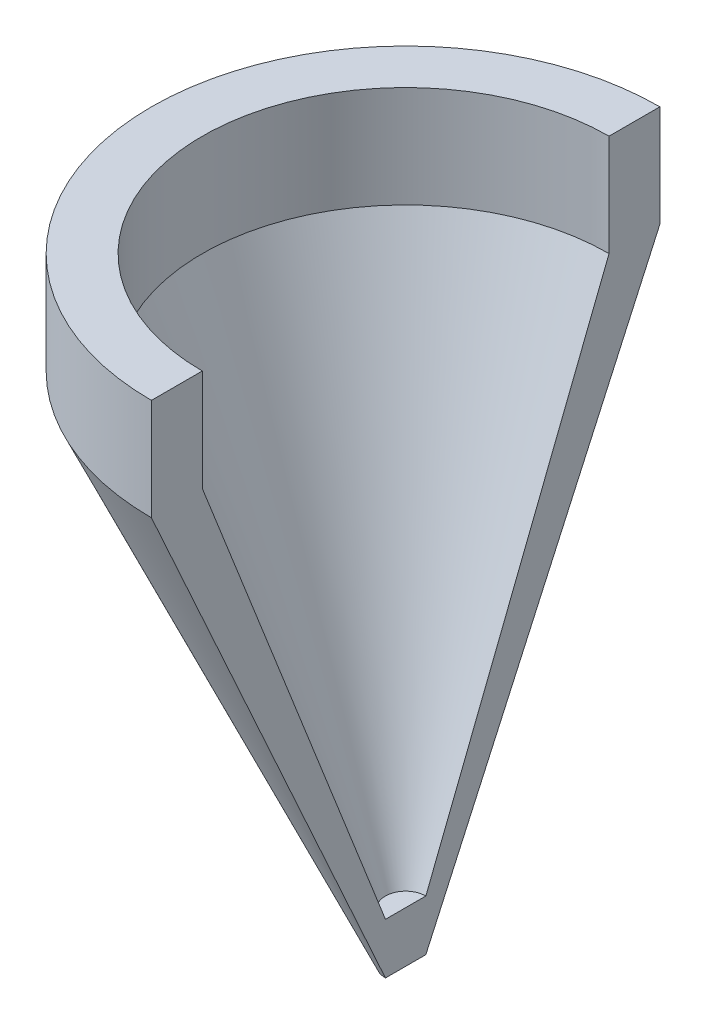
ISO-10303-21;
HEADER;
FILE_DESCRIPTION(('STEP AP214'),'2;1');
FILE_NAME('part.step','',(''),(''),'','','');
FILE_SCHEMA(('AUTOMOTIVE_DESIGN { 1 0 10303 214 1 1 1 1 }'));
ENDSEC;
DATA;
#1=APPLICATION_CONTEXT('core data for automotive mechanical design processes');
#2=APPLICATION_PROTOCOL_DEFINITION('international standard','automotive_design',2000,#1);
#3=PRODUCT_CONTEXT('',#1,'mechanical');
#4=PRODUCT('Part','Part','',(#3));
#5=PRODUCT_RELATED_PRODUCT_CATEGORY('part','',(#4));
#6=PRODUCT_DEFINITION_FORMATION('','',#4);
#7=PRODUCT_DEFINITION_CONTEXT('part definition',#1,'design');
#8=PRODUCT_DEFINITION('design','',#6,#7);
#9=PRODUCT_DEFINITION_SHAPE('','',#8);
#10=(LENGTH_UNIT() NAMED_UNIT(*) SI_UNIT(.MILLI.,.METRE.));
#11=(NAMED_UNIT(*) PLANE_ANGLE_UNIT() SI_UNIT($,.RADIAN.));
#12=(NAMED_UNIT(*) SI_UNIT($,.STERADIAN.) SOLID_ANGLE_UNIT());
#13=UNCERTAINTY_MEASURE_WITH_UNIT(LENGTH_MEASURE(1.E-05),#10,'distance_accuracy_value','');
#14=(GEOMETRIC_REPRESENTATION_CONTEXT(3) GLOBAL_UNCERTAINTY_ASSIGNED_CONTEXT((#13)) GLOBAL_UNIT_ASSIGNED_CONTEXT((#10,
#11,#12)) REPRESENTATION_CONTEXT('',''));
#15=CARTESIAN_POINT('',(0.,0.,0.));
#16=DIRECTION('',(0.,0.,1.));
#17=DIRECTION('',(1.,0.,0.));
#18=AXIS2_PLACEMENT_3D('',#15,#16,#17);
#19=CARTESIAN_POINT('',(0.,0.,0.));
#20=DIRECTION('',(1.,0.,0.));
#21=DIRECTION('',(0.,0.,-1.));
#22=AXIS2_PLACEMENT_3D('',#19,#20,#21);
#23=PLANE('',#22);
#24=DIRECTION('',(0.,-1.,0.));
#25=VECTOR('',#24,1.);
#26=CARTESIAN_POINT('',(0.,10.,-20.));
#27=LINE('',#26,#25);
#28=CARTESIAN_POINT('',(0.,0.,-20.));
#29=VERTEX_POINT('',#28);
#30=CARTESIAN_POINT('',(0.,10.,-20.));
#31=VERTEX_POINT('',#30);
#32=EDGE_CURVE('E69',#29,#31,#27,.F.);
#33=ORIENTED_EDGE('',*,*,#32,.F.);
#34=DIRECTION('',(0.,0.93033184896713,-0.366718762537999));
#35=VECTOR('',#34,1.);
#36=CARTESIAN_POINT('',(0.,-50.7381647193865,0.));
#37=LINE('',#36,#35);
#38=CARTESIAN_POINT('',(0.,-45.7009917153695,-1.98555585598167));
#39=VERTEX_POINT('',#38);
#40=EDGE_CURVE('E147',#29,#39,#37,.F.);
#41=ORIENTED_EDGE('',*,*,#40,.T.);
#42=DIRECTION('',(0.,0.,1.));
#43=VECTOR('',#42,1.);
#44=CARTESIAN_POINT('',(0.,-45.7009917153695,0.));
#45=LINE('',#44,#43);
#46=CARTESIAN_POINT('',(0.,-45.7009917153695,1.98555585598167));
#47=VERTEX_POINT('',#46);
#48=EDGE_CURVE('E141',#39,#47,#45,.T.);
#49=ORIENTED_EDGE('',*,*,#48,.T.);
#50=DIRECTION('',(0.,-0.93033184896713,-0.366718762537999));
#51=VECTOR('',#50,1.);
#52=CARTESIAN_POINT('',(0.,-50.7381647193865,0.));
#53=LINE('',#52,#51);
#54=CARTESIAN_POINT('',(0.,0.,20.));
#55=VERTEX_POINT('',#54);
#56=EDGE_CURVE('E146',#47,#55,#53,.F.);
#57=ORIENTED_EDGE('',*,*,#56,.T.);
#58=DIRECTION('',(0.,-1.,0.));
#59=VECTOR('',#58,1.);
#60=CARTESIAN_POINT('',(0.,10.,20.));
#61=LINE('',#60,#59);
#62=CARTESIAN_POINT('',(0.,10.,20.));
#63=VERTEX_POINT('',#62);
#64=EDGE_CURVE('E61',#63,#55,#61,.T.);
#65=ORIENTED_EDGE('',*,*,#64,.F.);
#66=DIRECTION('',(0.,0.,-1.));
#67=VECTOR('',#66,1.);
#68=CARTESIAN_POINT('',(0.,10.,0.));
#69=LINE('',#68,#67);
#70=CARTESIAN_POINT('',(0.,10.,25.));
#71=VERTEX_POINT('',#70);
#72=EDGE_CURVE('E115',#71,#63,#69,.T.);
#73=ORIENTED_EDGE('',*,*,#72,.F.);
#74=DIRECTION('',(0.,-1.,0.));
#75=VECTOR('',#74,1.);
#76=CARTESIAN_POINT('',(0.,10.,25.));
#77=LINE('',#76,#75);
#78=CARTESIAN_POINT('',(0.,0.,25.));
#79=VERTEX_POINT('',#78);
#80=EDGE_CURVE('E103',#71,#79,#77,.T.);
#81=ORIENTED_EDGE('',*,*,#80,.T.);
#82=DIRECTION('',(0.,-0.910579213139134,-0.413334606098879));
#83=VECTOR('',#82,1.);
#84=CARTESIAN_POINT('',(0.,-55.0751860419657,0.));
#85=LINE('',#84,#83);
#86=CARTESIAN_POINT('',(0.,-50.7009917153695,1.98555585598167));
#87=VERTEX_POINT('',#86);
#88=EDGE_CURVE('E114',#79,#87,#85,.T.);
#89=ORIENTED_EDGE('',*,*,#88,.T.);
#90=DIRECTION('',(0.,0.,-1.));
#91=VECTOR('',#90,1.);
#92=CARTESIAN_POINT('',(0.,-50.7009917153695,0.));
#93=LINE('',#92,#91);
#94=CARTESIAN_POINT('',(0.,-50.7009917153695,-1.98555585598167));
#95=VERTEX_POINT('',#94);
#96=EDGE_CURVE('E123',#87,#95,#93,.T.);
#97=ORIENTED_EDGE('',*,*,#96,.T.);
#98=DIRECTION('',(0.,0.910579213139134,-0.413334606098879));
#99=VECTOR('',#98,1.);
#100=CARTESIAN_POINT('',(0.,-55.0751860419657,0.));
#101=LINE('',#100,#99);
#102=CARTESIAN_POINT('',(0.,0.,-25.));
#103=VERTEX_POINT('',#102);
#104=EDGE_CURVE('E120',#95,#103,#101,.T.);
#105=ORIENTED_EDGE('',*,*,#104,.T.);
#106=DIRECTION('',(0.,-1.,0.));
#107=VECTOR('',#106,1.);
#108=CARTESIAN_POINT('',(0.,10.,-25.));
#109=LINE('',#108,#107);
#110=CARTESIAN_POINT('',(0.,10.,-25.));
#111=VERTEX_POINT('',#110);
#112=EDGE_CURVE('E105',#103,#111,#109,.F.);
#113=ORIENTED_EDGE('',*,*,#112,.T.);
#114=EDGE_CURVE('E161',#31,#111,#69,.T.);
#115=ORIENTED_EDGE('',*,*,#114,.F.);
#116=EDGE_LOOP('',(#33,#41,#49,#57,#65,#73,#81,#89,#97,#105,#113,#115));
#117=FACE_BOUND('',#116,.T.);
#118=ADVANCED_FACE('F45',(#117),#23,.T.);
#119=CARTESIAN_POINT('',(0.,10.,0.));
#120=DIRECTION('',(0.,1.,0.));
#121=DIRECTION('',(0.,0.,1.));
#122=AXIS2_PLACEMENT_3D('',#119,#120,#121);
#123=PLANE('',#122);
#124=CARTESIAN_POINT('',(0.,10.,0.));
#125=DIRECTION('',(0.,1.,0.));
#126=DIRECTION('',(0.,0.,1.));
#127=AXIS2_PLACEMENT_3D('',#124,#125,#126);
#128=CIRCLE('',#127,25.);
#129=EDGE_CURVE('E127',#111,#71,#128,.T.);
#130=ORIENTED_EDGE('',*,*,#129,.T.);
#131=ORIENTED_EDGE('',*,*,#72,.T.);
#132=CARTESIAN_POINT('',(0.,10.,0.));
#133=DIRECTION('',(0.,1.,0.));
#134=DIRECTION('',(0.,0.,1.));
#135=AXIS2_PLACEMENT_3D('',#132,#133,#134);
#136=CIRCLE('',#135,20.);
#137=EDGE_CURVE('E130',#31,#63,#136,.T.);
#138=ORIENTED_EDGE('',*,*,#137,.F.);
#139=ORIENTED_EDGE('',*,*,#114,.T.);
#140=EDGE_LOOP('',(#130,#131,#138,#139));
#141=FACE_BOUND('',#140,.T.);
#142=ADVANCED_FACE('F169',(#141),#123,.T.);
#143=CARTESIAN_POINT('',(0.,10.,0.));
#144=DIRECTION('',(0.,-1.,0.));
#145=DIRECTION('',(0.,0.,-1.));
#146=AXIS2_PLACEMENT_3D('',#143,#144,#145);
#147=CYLINDRICAL_SURFACE('',#146,25.);
#148=ORIENTED_EDGE('',*,*,#80,.F.);
#149=ORIENTED_EDGE('',*,*,#129,.F.);
#150=ORIENTED_EDGE('',*,*,#112,.F.);
#151=CARTESIAN_POINT('',(0.,0.,0.));
#152=DIRECTION('',(0.,1.,0.));
#153=DIRECTION('',(0.,0.,1.));
#154=AXIS2_PLACEMENT_3D('',#151,#152,#153);
#155=CIRCLE('',#154,25.);
#156=EDGE_CURVE('E54',#103,#79,#155,.T.);
#157=ORIENTED_EDGE('',*,*,#156,.T.);
#158=EDGE_LOOP('',(#148,#149,#150,#157));
#159=FACE_BOUND('',#158,.T.);
#160=ADVANCED_FACE('F102',(#159),#147,.T.);
#161=CARTESIAN_POINT('',(0.,10.,0.));
#162=DIRECTION('',(0.,-1.,0.));
#163=DIRECTION('',(0.,0.,-1.));
#164=AXIS2_PLACEMENT_3D('',#161,#162,#163);
#165=CYLINDRICAL_SURFACE('',#164,20.);
#166=ORIENTED_EDGE('',*,*,#137,.T.);
#167=ORIENTED_EDGE('',*,*,#64,.T.);
#168=CARTESIAN_POINT('',(0.,0.,0.));
#169=DIRECTION('',(0.,1.,0.));
#170=DIRECTION('',(0.,0.,1.));
#171=AXIS2_PLACEMENT_3D('',#168,#169,#170);
#172=CIRCLE('',#171,20.);
#173=EDGE_CURVE('E133',#29,#55,#172,.T.);
#174=ORIENTED_EDGE('',*,*,#173,.F.);
#175=ORIENTED_EDGE('',*,*,#32,.T.);
#176=EDGE_LOOP('',(#166,#167,#174,#175));
#177=FACE_BOUND('',#176,.T.);
#178=ADVANCED_FACE('F185',(#177),#165,.F.);
#179=CARTESIAN_POINT('',(0.,-45.7009917153695,0.));
#180=DIRECTION('',(0.,-1.,0.));
#181=DIRECTION('',(0.,0.,-1.));
#182=AXIS2_PLACEMENT_3D('',#179,#180,#181);
#183=PLANE('',#182);
#184=ORIENTED_EDGE('',*,*,#48,.F.);
#185=CARTESIAN_POINT('',(0.,-45.7009917153695,0.));
#186=DIRECTION('',(0.,1.,0.));
#187=DIRECTION('',(0.,0.,1.));
#188=AXIS2_PLACEMENT_3D('',#185,#186,#187);
#189=CIRCLE('',#188,1.98555585598167);
#190=EDGE_CURVE('E111',#39,#47,#189,.T.);
#191=ORIENTED_EDGE('',*,*,#190,.T.);
#192=EDGE_LOOP('',(#184,#191));
#193=FACE_BOUND('',#192,.T.);
#194=ADVANCED_FACE('F140',(#193),#183,.F.);
#195=CARTESIAN_POINT('',(0.,0.,0.));
#196=DIRECTION('',(0.,1.,0.));
#197=DIRECTION('',(0.,0.,1.));
#198=AXIS2_PLACEMENT_3D('',#195,#196,#197);
#199=CONICAL_SURFACE('',#198,20.,0.375479604447757);
#200=ORIENTED_EDGE('',*,*,#40,.F.);
#201=ORIENTED_EDGE('',*,*,#173,.T.);
#202=ORIENTED_EDGE('',*,*,#56,.F.);
#203=ORIENTED_EDGE('',*,*,#190,.F.);
#204=EDGE_LOOP('',(#200,#201,#202,#203));
#205=FACE_BOUND('',#204,.T.);
#206=ADVANCED_FACE('F150',(#205),#199,.F.);
#207=CARTESIAN_POINT('',(1.98555585598167,-50.7009917153695,0.));
#208=DIRECTION('',(0.,1.,0.));
#209=DIRECTION('',(0.,0.,1.));
#210=AXIS2_PLACEMENT_3D('',#207,#208,#209);
#211=PLANE('',#210);
#212=ORIENTED_EDGE('',*,*,#96,.F.);
#213=CARTESIAN_POINT('',(0.,-50.7009917153695,0.));
#214=DIRECTION('',(0.,1.,0.));
#215=DIRECTION('',(0.,0.,1.));
#216=AXIS2_PLACEMENT_3D('',#213,#214,#215);
#217=CIRCLE('',#216,1.98555585598167);
#218=EDGE_CURVE('E11',#95,#87,#217,.T.);
#219=ORIENTED_EDGE('',*,*,#218,.F.);
#220=EDGE_LOOP('',(#212,#219));
#221=FACE_BOUND('',#220,.T.);
#222=ADVANCED_FACE('F171',(#221),#211,.F.);
#223=CARTESIAN_POINT('',(0.,-50.7009917153695,0.));
#224=DIRECTION('',(0.,1.,0.));
#225=DIRECTION('',(0.,0.,1.));
#226=AXIS2_PLACEMENT_3D('',#223,#224,#225);
#227=CONICAL_SURFACE('',#226,1.98555585598167,0.426113103055392);
#228=ORIENTED_EDGE('',*,*,#104,.F.);
#229=ORIENTED_EDGE('',*,*,#218,.T.);
#230=ORIENTED_EDGE('',*,*,#88,.F.);
#231=ORIENTED_EDGE('',*,*,#156,.F.);
#232=EDGE_LOOP('',(#228,#229,#230,#231));
#233=FACE_BOUND('',#232,.T.);
#234=ADVANCED_FACE('F47',(#233),#227,.T.);
#235=CLOSED_SHELL('',(#118,#142,#160,#178,#194,#206,#222,#234));
#236=MANIFOLD_SOLID_BREP('B2',#235);
#237=ADVANCED_BREP_SHAPE_REPRESENTATION('',(#18,#236),#14);
#238=SHAPE_DEFINITION_REPRESENTATION(#9,#237);
ENDSEC;
END-ISO-10303-21;
